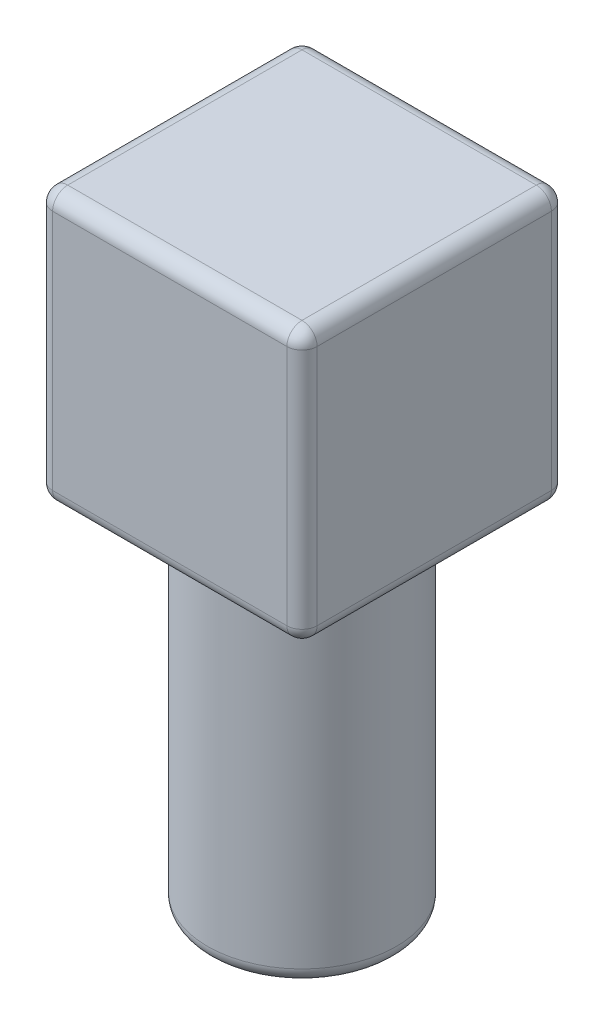
ISO-10303-21;
HEADER;
FILE_DESCRIPTION(('STEP AP214'),'2;1');
FILE_NAME('part.step','',(''),(''),'','','');
FILE_SCHEMA(('AUTOMOTIVE_DESIGN { 1 0 10303 214 1 1 1 1 }'));
ENDSEC;
DATA;
#1=APPLICATION_CONTEXT('core data for automotive mechanical design processes');
#2=APPLICATION_PROTOCOL_DEFINITION('international standard','automotive_design',2000,#1);
#3=PRODUCT_CONTEXT('',#1,'mechanical');
#4=PRODUCT('Part','Part','',(#3));
#5=PRODUCT_RELATED_PRODUCT_CATEGORY('part','',(#4));
#6=PRODUCT_DEFINITION_FORMATION('','',#4);
#7=PRODUCT_DEFINITION_CONTEXT('part definition',#1,'design');
#8=PRODUCT_DEFINITION('design','',#6,#7);
#9=PRODUCT_DEFINITION_SHAPE('','',#8);
#10=(LENGTH_UNIT() NAMED_UNIT(*) SI_UNIT(.MILLI.,.METRE.));
#11=(NAMED_UNIT(*) PLANE_ANGLE_UNIT() SI_UNIT($,.RADIAN.));
#12=(NAMED_UNIT(*) SI_UNIT($,.STERADIAN.) SOLID_ANGLE_UNIT());
#13=UNCERTAINTY_MEASURE_WITH_UNIT(LENGTH_MEASURE(1.E-05),#10,'distance_accuracy_value','');
#14=(GEOMETRIC_REPRESENTATION_CONTEXT(3) GLOBAL_UNCERTAINTY_ASSIGNED_CONTEXT((#13)) GLOBAL_UNIT_ASSIGNED_CONTEXT((#10,
#11,#12)) REPRESENTATION_CONTEXT('',''));
#15=CARTESIAN_POINT('',(0.,0.,0.));
#16=DIRECTION('',(0.,0.,1.));
#17=DIRECTION('',(1.,0.,0.));
#18=AXIS2_PLACEMENT_3D('',#15,#16,#17);
#19=CARTESIAN_POINT('',(0.,47.,0.));
#20=DIRECTION('',(0.,-1.,0.));
#21=DIRECTION('',(0.,0.,-1.));
#22=AXIS2_PLACEMENT_3D('',#19,#20,#21);
#23=CYLINDRICAL_SURFACE('',#22,12.5);
#24=CARTESIAN_POINT('',(0.,2.,0.));
#25=DIRECTION('',(0.,1.,0.));
#26=DIRECTION('',(0.,0.,1.));
#27=AXIS2_PLACEMENT_3D('',#24,#25,#26);
#28=CIRCLE('',#27,12.5);
#29=CARTESIAN_POINT('',(0.,2.,12.5));
#30=VERTEX_POINT('',#29);
#31=EDGE_CURVE('E170',#30,#30,#28,.T.);
#32=ORIENTED_EDGE('',*,*,#31,.T.);
#33=EDGE_LOOP('',(#32));
#34=FACE_BOUND('',#33,.T.);
#35=CARTESIAN_POINT('',(0.,47.,0.));
#36=DIRECTION('',(0.,1.,0.));
#37=DIRECTION('',(0.,0.,1.));
#38=AXIS2_PLACEMENT_3D('',#35,#36,#37);
#39=CIRCLE('',#38,12.5);
#40=CARTESIAN_POINT('',(0.,47.,12.5));
#41=VERTEX_POINT('',#40);
#42=EDGE_CURVE('E267',#41,#41,#39,.T.);
#43=ORIENTED_EDGE('',*,*,#42,.F.);
#44=EDGE_LOOP('',(#43));
#45=FACE_BOUND('',#44,.T.);
#46=ADVANCED_FACE('F40',(#34,#45),#23,.T.);
#47=CARTESIAN_POINT('',(0.,0.,0.));
#48=DIRECTION('',(0.,1.,0.));
#49=DIRECTION('',(0.,0.,1.));
#50=AXIS2_PLACEMENT_3D('',#47,#48,#49);
#51=PLANE('',#50);
#52=CARTESIAN_POINT('',(0.,0.,0.));
#53=DIRECTION('',(0.,1.,0.));
#54=DIRECTION('',(0.,0.,1.));
#55=AXIS2_PLACEMENT_3D('',#52,#53,#54);
#56=CIRCLE('',#55,10.5);
#57=CARTESIAN_POINT('',(0.,0.,10.5));
#58=VERTEX_POINT('',#57);
#59=EDGE_CURVE('E167',#58,#58,#56,.F.);
#60=ORIENTED_EDGE('',*,*,#59,.T.);
#61=EDGE_LOOP('',(#60));
#62=FACE_BOUND('',#61,.T.);
#63=ADVANCED_FACE('F296',(#62),#51,.F.);
#64=CARTESIAN_POINT('',(-17.5,83.,17.5));
#65=DIRECTION('',(-1.,0.,0.));
#66=DIRECTION('',(0.,0.,1.));
#67=AXIS2_PLACEMENT_3D('',#64,#65,#66);
#68=PLANE('',#67);
#69=DIRECTION('',(0.,0.,-1.));
#70=VECTOR('',#69,1.);
#71=CARTESIAN_POINT('',(-17.5,81.,-17.5));
#72=LINE('',#71,#70);
#73=CARTESIAN_POINT('',(-17.5,81.,15.5));
#74=VERTEX_POINT('',#73);
#75=CARTESIAN_POINT('',(-17.5,81.,-15.5));
#76=VERTEX_POINT('',#75);
#77=EDGE_CURVE('E179',#74,#76,#72,.T.);
#78=ORIENTED_EDGE('',*,*,#77,.T.);
#79=DIRECTION('',(0.,-1.,0.));
#80=VECTOR('',#79,1.);
#81=CARTESIAN_POINT('',(-17.5,83.,-15.5));
#82=LINE('',#81,#80);
#83=CARTESIAN_POINT('',(-17.5,49.,-15.5));
#84=VERTEX_POINT('',#83);
#85=EDGE_CURVE('E184',#76,#84,#82,.T.);
#86=ORIENTED_EDGE('',*,*,#85,.T.);
#87=DIRECTION('',(0.,0.,-1.));
#88=VECTOR('',#87,1.);
#89=CARTESIAN_POINT('',(-17.5,49.,17.5));
#90=LINE('',#89,#88);
#91=CARTESIAN_POINT('',(-17.5,49.,15.5));
#92=VERTEX_POINT('',#91);
#93=EDGE_CURVE('E181',#84,#92,#90,.F.);
#94=ORIENTED_EDGE('',*,*,#93,.T.);
#95=DIRECTION('',(0.,-1.,0.));
#96=VECTOR('',#95,1.);
#97=CARTESIAN_POINT('',(-17.5,83.,15.5));
#98=LINE('',#97,#96);
#99=EDGE_CURVE('E177',#92,#74,#98,.F.);
#100=ORIENTED_EDGE('',*,*,#99,.T.);
#101=EDGE_LOOP('',(#78,#86,#94,#100));
#102=FACE_BOUND('',#101,.T.);
#103=ADVANCED_FACE('F300',(#102),#68,.T.);
#104=CARTESIAN_POINT('',(-17.5,83.,17.5));
#105=DIRECTION('',(0.,0.,-1.));
#106=DIRECTION('',(-1.,0.,0.));
#107=AXIS2_PLACEMENT_3D('',#104,#105,#106);
#108=PLANE('',#107);
#109=DIRECTION('',(1.,0.,0.));
#110=VECTOR('',#109,1.);
#111=CARTESIAN_POINT('',(17.5,49.,17.5));
#112=LINE('',#111,#110);
#113=CARTESIAN_POINT('',(-15.5,49.,17.5));
#114=VERTEX_POINT('',#113);
#115=CARTESIAN_POINT('',(15.5,49.,17.5));
#116=VERTEX_POINT('',#115);
#117=EDGE_CURVE('E206',#114,#116,#112,.T.);
#118=ORIENTED_EDGE('',*,*,#117,.T.);
#119=DIRECTION('',(0.,-1.,0.));
#120=VECTOR('',#119,1.);
#121=CARTESIAN_POINT('',(15.5,83.,17.5));
#122=LINE('',#121,#120);
#123=CARTESIAN_POINT('',(15.5,81.,17.5));
#124=VERTEX_POINT('',#123);
#125=EDGE_CURVE('E209',#116,#124,#122,.F.);
#126=ORIENTED_EDGE('',*,*,#125,.T.);
#127=DIRECTION('',(1.,0.,0.));
#128=VECTOR('',#127,1.);
#129=CARTESIAN_POINT('',(-17.5,81.,17.5));
#130=LINE('',#129,#128);
#131=CARTESIAN_POINT('',(-15.5,81.,17.5));
#132=VERTEX_POINT('',#131);
#133=EDGE_CURVE('E204',#124,#132,#130,.F.);
#134=ORIENTED_EDGE('',*,*,#133,.T.);
#135=DIRECTION('',(0.,-1.,0.));
#136=VECTOR('',#135,1.);
#137=CARTESIAN_POINT('',(-15.5,47.,17.5));
#138=LINE('',#137,#136);
#139=EDGE_CURVE('E202',#132,#114,#138,.T.);
#140=ORIENTED_EDGE('',*,*,#139,.T.);
#141=EDGE_LOOP('',(#118,#126,#134,#140));
#142=FACE_BOUND('',#141,.T.);
#143=ADVANCED_FACE('F306',(#142),#108,.F.);
#144=CARTESIAN_POINT('',(17.5,83.,17.5));
#145=DIRECTION('',(-1.,0.,0.));
#146=DIRECTION('',(0.,0.,1.));
#147=AXIS2_PLACEMENT_3D('',#144,#145,#146);
#148=PLANE('',#147);
#149=DIRECTION('',(0.,0.,-1.));
#150=VECTOR('',#149,1.);
#151=CARTESIAN_POINT('',(17.5,49.,-17.5));
#152=LINE('',#151,#150);
#153=CARTESIAN_POINT('',(17.5,49.,15.5));
#154=VERTEX_POINT('',#153);
#155=CARTESIAN_POINT('',(17.5,49.,-15.5));
#156=VERTEX_POINT('',#155);
#157=EDGE_CURVE('E148',#154,#156,#152,.T.);
#158=ORIENTED_EDGE('',*,*,#157,.T.);
#159=DIRECTION('',(0.,-1.,0.));
#160=VECTOR('',#159,1.);
#161=CARTESIAN_POINT('',(17.5,83.,-15.5));
#162=LINE('',#161,#160);
#163=CARTESIAN_POINT('',(17.5,81.,-15.5));
#164=VERTEX_POINT('',#163);
#165=EDGE_CURVE('E200',#156,#164,#162,.F.);
#166=ORIENTED_EDGE('',*,*,#165,.T.);
#167=DIRECTION('',(0.,0.,-1.));
#168=VECTOR('',#167,1.);
#169=CARTESIAN_POINT('',(17.5,81.,17.5));
#170=LINE('',#169,#168);
#171=CARTESIAN_POINT('',(17.5,81.,15.5));
#172=VERTEX_POINT('',#171);
#173=EDGE_CURVE('E197',#164,#172,#170,.F.);
#174=ORIENTED_EDGE('',*,*,#173,.T.);
#175=DIRECTION('',(0.,-1.,0.));
#176=VECTOR('',#175,1.);
#177=CARTESIAN_POINT('',(17.5,83.,15.5));
#178=LINE('',#177,#176);
#179=EDGE_CURVE('E195',#172,#154,#178,.T.);
#180=ORIENTED_EDGE('',*,*,#179,.T.);
#181=EDGE_LOOP('',(#158,#166,#174,#180));
#182=FACE_BOUND('',#181,.T.);
#183=ADVANCED_FACE('F311',(#182),#148,.F.);
#184=CARTESIAN_POINT('',(-17.5,83.,-17.5));
#185=DIRECTION('',(0.,0.,-1.));
#186=DIRECTION('',(-1.,0.,0.));
#187=AXIS2_PLACEMENT_3D('',#184,#185,#186);
#188=PLANE('',#187);
#189=DIRECTION('',(1.,0.,0.));
#190=VECTOR('',#189,1.);
#191=CARTESIAN_POINT('',(-17.5,49.,-17.5));
#192=LINE('',#191,#190);
#193=CARTESIAN_POINT('',(15.5,49.,-17.5));
#194=VERTEX_POINT('',#193);
#195=CARTESIAN_POINT('',(-15.5,49.,-17.5));
#196=VERTEX_POINT('',#195);
#197=EDGE_CURVE('E190',#194,#196,#192,.F.);
#198=ORIENTED_EDGE('',*,*,#197,.T.);
#199=DIRECTION('',(0.,-1.,0.));
#200=VECTOR('',#199,1.);
#201=CARTESIAN_POINT('',(-15.5,83.,-17.5));
#202=LINE('',#201,#200);
#203=CARTESIAN_POINT('',(-15.5,81.,-17.5));
#204=VERTEX_POINT('',#203);
#205=EDGE_CURVE('E193',#196,#204,#202,.F.);
#206=ORIENTED_EDGE('',*,*,#205,.T.);
#207=DIRECTION('',(1.,0.,0.));
#208=VECTOR('',#207,1.);
#209=CARTESIAN_POINT('',(17.5,81.,-17.5));
#210=LINE('',#209,#208);
#211=CARTESIAN_POINT('',(15.5,81.,-17.5));
#212=VERTEX_POINT('',#211);
#213=EDGE_CURVE('E188',#204,#212,#210,.T.);
#214=ORIENTED_EDGE('',*,*,#213,.T.);
#215=DIRECTION('',(0.,-1.,0.));
#216=VECTOR('',#215,1.);
#217=CARTESIAN_POINT('',(15.5,47.,-17.5));
#218=LINE('',#217,#216);
#219=EDGE_CURVE('E186',#212,#194,#218,.T.);
#220=ORIENTED_EDGE('',*,*,#219,.T.);
#221=EDGE_LOOP('',(#198,#206,#214,#220));
#222=FACE_BOUND('',#221,.T.);
#223=ADVANCED_FACE('F308',(#222),#188,.T.);
#224=CARTESIAN_POINT('',(0.,83.,0.));
#225=DIRECTION('',(0.,-1.,0.));
#226=DIRECTION('',(0.,0.,-1.));
#227=AXIS2_PLACEMENT_3D('',#224,#225,#226);
#228=PLANE('',#227);
#229=DIRECTION('',(1.,0.,0.));
#230=VECTOR('',#229,1.);
#231=CARTESIAN_POINT('',(-17.5,83.,-15.5));
#232=LINE('',#231,#230);
#233=CARTESIAN_POINT('',(15.5,83.,-15.5));
#234=VERTEX_POINT('',#233);
#235=CARTESIAN_POINT('',(-15.5,83.,-15.5));
#236=VERTEX_POINT('',#235);
#237=EDGE_CURVE('E49',#234,#236,#232,.F.);
#238=ORIENTED_EDGE('',*,*,#237,.T.);
#239=DIRECTION('',(0.,0.,-1.));
#240=VECTOR('',#239,1.);
#241=CARTESIAN_POINT('',(-15.5,83.,17.5));
#242=LINE('',#241,#240);
#243=CARTESIAN_POINT('',(-15.5,83.,15.5));
#244=VERTEX_POINT('',#243);
#245=EDGE_CURVE('E11',#236,#244,#242,.F.);
#246=ORIENTED_EDGE('',*,*,#245,.T.);
#247=DIRECTION('',(1.,0.,0.));
#248=VECTOR('',#247,1.);
#249=CARTESIAN_POINT('',(0.,83.,15.5));
#250=LINE('',#249,#248);
#251=CARTESIAN_POINT('',(15.5,83.,15.5));
#252=VERTEX_POINT('',#251);
#253=EDGE_CURVE('E211',#244,#252,#250,.T.);
#254=ORIENTED_EDGE('',*,*,#253,.T.);
#255=DIRECTION('',(0.,0.,-1.));
#256=VECTOR('',#255,1.);
#257=CARTESIAN_POINT('',(15.5,83.,0.));
#258=LINE('',#257,#256);
#259=EDGE_CURVE('E60',#252,#234,#258,.T.);
#260=ORIENTED_EDGE('',*,*,#259,.T.);
#261=EDGE_LOOP('',(#238,#246,#254,#260));
#262=FACE_BOUND('',#261,.T.);
#263=ADVANCED_FACE('F290',(#262),#228,.F.);
#264=CARTESIAN_POINT('',(0.,47.,0.));
#265=DIRECTION('',(0.,-1.,0.));
#266=DIRECTION('',(0.,0.,-1.));
#267=AXIS2_PLACEMENT_3D('',#264,#265,#266);
#268=PLANE('',#267);
#269=DIRECTION('',(1.,0.,0.));
#270=VECTOR('',#269,1.);
#271=CARTESIAN_POINT('',(-17.5,47.,15.5));
#272=LINE('',#271,#270);
#273=CARTESIAN_POINT('',(15.5,47.,15.5));
#274=VERTEX_POINT('',#273);
#275=CARTESIAN_POINT('',(-15.5,47.,15.5));
#276=VERTEX_POINT('',#275);
#277=EDGE_CURVE('E134',#274,#276,#272,.F.);
#278=ORIENTED_EDGE('',*,*,#277,.T.);
#279=DIRECTION('',(0.,0.,-1.));
#280=VECTOR('',#279,1.);
#281=CARTESIAN_POINT('',(-15.5,47.,0.));
#282=LINE('',#281,#280);
#283=CARTESIAN_POINT('',(-15.5,47.,-15.5));
#284=VERTEX_POINT('',#283);
#285=EDGE_CURVE('E175',#276,#284,#282,.T.);
#286=ORIENTED_EDGE('',*,*,#285,.T.);
#287=DIRECTION('',(1.,0.,0.));
#288=VECTOR('',#287,1.);
#289=CARTESIAN_POINT('',(0.,47.,-15.5));
#290=LINE('',#289,#288);
#291=CARTESIAN_POINT('',(15.5,47.,-15.5));
#292=VERTEX_POINT('',#291);
#293=EDGE_CURVE('E137',#284,#292,#290,.T.);
#294=ORIENTED_EDGE('',*,*,#293,.T.);
#295=DIRECTION('',(0.,0.,-1.));
#296=VECTOR('',#295,1.);
#297=CARTESIAN_POINT('',(15.5,47.,17.5));
#298=LINE('',#297,#296);
#299=EDGE_CURVE('E128',#292,#274,#298,.F.);
#300=ORIENTED_EDGE('',*,*,#299,.T.);
#301=EDGE_LOOP('',(#278,#286,#294,#300));
#302=FACE_BOUND('',#301,.T.);
#303=ORIENTED_EDGE('',*,*,#42,.T.);
#304=EDGE_LOOP('',(#303));
#305=FACE_BOUND('',#304,.T.);
#306=ADVANCED_FACE('F130',(#302,#305),#268,.T.);
#307=CARTESIAN_POINT('',(0.,2.,0.));
#308=DIRECTION('',(0.,1.,0.));
#309=DIRECTION('',(0.,0.,1.));
#310=AXIS2_PLACEMENT_3D('',#307,#308,#309);
#311=TOROIDAL_SURFACE('',#310,10.5,2.);
#312=ORIENTED_EDGE('',*,*,#59,.F.);
#313=EDGE_LOOP('',(#312));
#314=FACE_BOUND('',#313,.T.);
#315=ORIENTED_EDGE('',*,*,#31,.F.);
#316=EDGE_LOOP('',(#315));
#317=FACE_BOUND('',#316,.T.);
#318=ADVANCED_FACE('F280',(#314,#317),#311,.T.);
#319=CARTESIAN_POINT('',(15.5,81.,0.));
#320=DIRECTION('',(0.,0.,-1.));
#321=DIRECTION('',(-1.,0.,0.));
#322=AXIS2_PLACEMENT_3D('',#319,#320,#321);
#323=CYLINDRICAL_SURFACE('',#322,2.);
#324=CARTESIAN_POINT('',(15.5,81.,15.5));
#325=DIRECTION('',(0.,0.,1.));
#326=DIRECTION('',(1.,0.,0.));
#327=AXIS2_PLACEMENT_3D('',#324,#325,#326);
#328=CIRCLE('',#327,2.);
#329=EDGE_CURVE('E44',#172,#252,#328,.T.);
#330=ORIENTED_EDGE('',*,*,#329,.F.);
#331=ORIENTED_EDGE('',*,*,#173,.F.);
#332=CARTESIAN_POINT('',(15.5,81.,-15.5));
#333=DIRECTION('',(0.,0.,-1.));
#334=DIRECTION('',(-1.,0.,0.));
#335=AXIS2_PLACEMENT_3D('',#332,#333,#334);
#336=CIRCLE('',#335,2.);
#337=EDGE_CURVE('E261',#234,#164,#336,.T.);
#338=ORIENTED_EDGE('',*,*,#337,.F.);
#339=ORIENTED_EDGE('',*,*,#259,.F.);
#340=EDGE_LOOP('',(#330,#331,#338,#339));
#341=FACE_BOUND('',#340,.T.);
#342=ADVANCED_FACE('F42',(#341),#323,.T.);
#343=CARTESIAN_POINT('',(15.5,81.,15.5));
#344=DIRECTION('',(0.,1.,0.));
#345=DIRECTION('',(0.,0.,1.));
#346=AXIS2_PLACEMENT_3D('',#343,#344,#345);
#347=SPHERICAL_SURFACE('',#346,2.);
#348=CARTESIAN_POINT('',(15.5,81.,15.5));
#349=DIRECTION('',(0.,1.,0.));
#350=DIRECTION('',(0.,0.,1.));
#351=AXIS2_PLACEMENT_3D('',#348,#349,#350);
#352=CIRCLE('',#351,2.);
#353=EDGE_CURVE('E256',#172,#124,#352,.F.);
#354=ORIENTED_EDGE('',*,*,#353,.F.);
#355=ORIENTED_EDGE('',*,*,#329,.T.);
#356=CARTESIAN_POINT('',(15.5,81.,15.5));
#357=DIRECTION('',(1.,0.,0.));
#358=DIRECTION('',(0.,0.,-1.));
#359=AXIS2_PLACEMENT_3D('',#356,#357,#358);
#360=CIRCLE('',#359,2.);
#361=EDGE_CURVE('E259',#124,#252,#360,.F.);
#362=ORIENTED_EDGE('',*,*,#361,.F.);
#363=EDGE_LOOP('',(#354,#355,#362));
#364=FACE_BOUND('',#363,.T.);
#365=ADVANCED_FACE('F288',(#364),#347,.T.);
#366=CARTESIAN_POINT('',(15.5,81.,-15.5));
#367=DIRECTION('',(1.,0.,0.));
#368=DIRECTION('',(0.,0.,-1.));
#369=AXIS2_PLACEMENT_3D('',#366,#367,#368);
#370=SPHERICAL_SURFACE('',#369,2.);
#371=CARTESIAN_POINT('',(15.5,81.,-15.5));
#372=DIRECTION('',(1.,0.,0.));
#373=DIRECTION('',(0.,1.,0.));
#374=AXIS2_PLACEMENT_3D('',#371,#372,#373);
#375=CIRCLE('',#374,2.);
#376=EDGE_CURVE('E250',#234,#212,#375,.F.);
#377=ORIENTED_EDGE('',*,*,#376,.F.);
#378=ORIENTED_EDGE('',*,*,#337,.T.);
#379=CARTESIAN_POINT('',(15.5,81.,-15.5));
#380=DIRECTION('',(0.,1.,0.));
#381=DIRECTION('',(0.,0.,1.));
#382=AXIS2_PLACEMENT_3D('',#379,#380,#381);
#383=CIRCLE('',#382,2.);
#384=EDGE_CURVE('E253',#212,#164,#383,.F.);
#385=ORIENTED_EDGE('',*,*,#384,.F.);
#386=EDGE_LOOP('',(#377,#378,#385));
#387=FACE_BOUND('',#386,.T.);
#388=ADVANCED_FACE('F349',(#387),#370,.T.);
#389=CARTESIAN_POINT('',(0.,81.,15.5));
#390=DIRECTION('',(1.,0.,0.));
#391=DIRECTION('',(0.,0.,-1.));
#392=AXIS2_PLACEMENT_3D('',#389,#390,#391);
#393=CYLINDRICAL_SURFACE('',#392,2.);
#394=ORIENTED_EDGE('',*,*,#361,.T.);
#395=ORIENTED_EDGE('',*,*,#253,.F.);
#396=CARTESIAN_POINT('',(-15.5,81.,15.5));
#397=DIRECTION('',(-1.,0.,0.));
#398=DIRECTION('',(0.,0.,1.));
#399=AXIS2_PLACEMENT_3D('',#396,#397,#398);
#400=CIRCLE('',#399,2.);
#401=EDGE_CURVE('E245',#132,#244,#400,.T.);
#402=ORIENTED_EDGE('',*,*,#401,.F.);
#403=ORIENTED_EDGE('',*,*,#133,.F.);
#404=EDGE_LOOP('',(#394,#395,#402,#403));
#405=FACE_BOUND('',#404,.T.);
#406=ADVANCED_FACE('F357',(#405),#393,.T.);
#407=CARTESIAN_POINT('',(15.5,83.,15.5));
#408=DIRECTION('',(0.,-1.,0.));
#409=DIRECTION('',(0.,0.,-1.));
#410=AXIS2_PLACEMENT_3D('',#407,#408,#409);
#411=CYLINDRICAL_SURFACE('',#410,2.);
#412=ORIENTED_EDGE('',*,*,#353,.T.);
#413=ORIENTED_EDGE('',*,*,#125,.F.);
#414=CARTESIAN_POINT('',(15.5,49.,15.5));
#415=DIRECTION('',(0.,-1.,0.));
#416=DIRECTION('',(0.,0.,-1.));
#417=AXIS2_PLACEMENT_3D('',#414,#415,#416);
#418=CIRCLE('',#417,2.);
#419=EDGE_CURVE('E152',#154,#116,#418,.T.);
#420=ORIENTED_EDGE('',*,*,#419,.F.);
#421=ORIENTED_EDGE('',*,*,#179,.F.);
#422=EDGE_LOOP('',(#412,#413,#420,#421));
#423=FACE_BOUND('',#422,.T.);
#424=ADVANCED_FACE('F366',(#423),#411,.T.);
#425=CARTESIAN_POINT('',(15.5,49.,17.5));
#426=DIRECTION('',(0.,0.,1.));
#427=DIRECTION('',(1.,0.,0.));
#428=AXIS2_PLACEMENT_3D('',#425,#426,#427);
#429=CYLINDRICAL_SURFACE('',#428,2.);
#430=CARTESIAN_POINT('',(15.5,49.,-15.5));
#431=DIRECTION('',(0.,0.,-1.));
#432=DIRECTION('',(-1.,0.,0.));
#433=AXIS2_PLACEMENT_3D('',#430,#431,#432);
#434=CIRCLE('',#433,2.);
#435=EDGE_CURVE('E153',#156,#292,#434,.T.);
#436=ORIENTED_EDGE('',*,*,#435,.F.);
#437=ORIENTED_EDGE('',*,*,#157,.F.);
#438=CARTESIAN_POINT('',(15.5,49.,15.5));
#439=DIRECTION('',(0.,0.,1.));
#440=DIRECTION('',(1.,0.,0.));
#441=AXIS2_PLACEMENT_3D('',#438,#439,#440);
#442=CIRCLE('',#441,2.);
#443=EDGE_CURVE('E144',#274,#154,#442,.T.);
#444=ORIENTED_EDGE('',*,*,#443,.F.);
#445=ORIENTED_EDGE('',*,*,#299,.F.);
#446=EDGE_LOOP('',(#436,#437,#444,#445));
#447=FACE_BOUND('',#446,.T.);
#448=ADVANCED_FACE('F146',(#447),#429,.T.);
#449=CARTESIAN_POINT('',(15.5,83.,-15.5));
#450=DIRECTION('',(0.,1.,0.));
#451=DIRECTION('',(0.,0.,1.));
#452=AXIS2_PLACEMENT_3D('',#449,#450,#451);
#453=CYLINDRICAL_SURFACE('',#452,2.);
#454=ORIENTED_EDGE('',*,*,#384,.T.);
#455=ORIENTED_EDGE('',*,*,#165,.F.);
#456=CARTESIAN_POINT('',(15.5,49.,-15.5));
#457=DIRECTION('',(0.,-1.,0.));
#458=DIRECTION('',(0.,0.,-1.));
#459=AXIS2_PLACEMENT_3D('',#456,#457,#458);
#460=CIRCLE('',#459,2.);
#461=EDGE_CURVE('E241',#194,#156,#460,.T.);
#462=ORIENTED_EDGE('',*,*,#461,.F.);
#463=ORIENTED_EDGE('',*,*,#219,.F.);
#464=EDGE_LOOP('',(#454,#455,#462,#463));
#465=FACE_BOUND('',#464,.T.);
#466=ADVANCED_FACE('F385',(#465),#453,.T.);
#467=CARTESIAN_POINT('',(-17.5,81.,-15.5));
#468=DIRECTION('',(-1.,0.,0.));
#469=DIRECTION('',(0.,0.,1.));
#470=AXIS2_PLACEMENT_3D('',#467,#468,#469);
#471=CYLINDRICAL_SURFACE('',#470,2.);
#472=ORIENTED_EDGE('',*,*,#376,.T.);
#473=ORIENTED_EDGE('',*,*,#213,.F.);
#474=CARTESIAN_POINT('',(-15.5,81.,-15.5));
#475=DIRECTION('',(-1.,0.,0.));
#476=DIRECTION('',(0.,0.,1.));
#477=AXIS2_PLACEMENT_3D('',#474,#475,#476);
#478=CIRCLE('',#477,2.);
#479=EDGE_CURVE('E238',#236,#204,#478,.T.);
#480=ORIENTED_EDGE('',*,*,#479,.F.);
#481=ORIENTED_EDGE('',*,*,#237,.F.);
#482=EDGE_LOOP('',(#472,#473,#480,#481));
#483=FACE_BOUND('',#482,.T.);
#484=ADVANCED_FACE('F394',(#483),#471,.T.);
#485=CARTESIAN_POINT('',(-15.5,81.,17.5));
#486=DIRECTION('',(0.,0.,1.));
#487=DIRECTION('',(1.,0.,0.));
#488=AXIS2_PLACEMENT_3D('',#485,#486,#487);
#489=CYLINDRICAL_SURFACE('',#488,2.);
#490=CARTESIAN_POINT('',(-15.5,81.,15.5));
#491=DIRECTION('',(0.,0.,1.));
#492=DIRECTION('',(1.,0.,0.));
#493=AXIS2_PLACEMENT_3D('',#490,#491,#492);
#494=CIRCLE('',#493,2.);
#495=EDGE_CURVE('E247',#244,#74,#494,.T.);
#496=ORIENTED_EDGE('',*,*,#495,.F.);
#497=ORIENTED_EDGE('',*,*,#245,.F.);
#498=CARTESIAN_POINT('',(-15.5,81.,-15.5));
#499=DIRECTION('',(0.,0.,-1.));
#500=DIRECTION('',(0.,1.,0.));
#501=AXIS2_PLACEMENT_3D('',#498,#499,#500);
#502=CIRCLE('',#501,2.);
#503=EDGE_CURVE('E235',#76,#236,#502,.T.);
#504=ORIENTED_EDGE('',*,*,#503,.F.);
#505=ORIENTED_EDGE('',*,*,#77,.F.);
#506=EDGE_LOOP('',(#496,#497,#504,#505));
#507=FACE_BOUND('',#506,.T.);
#508=ADVANCED_FACE('F404',(#507),#489,.T.);
#509=CARTESIAN_POINT('',(-15.5,81.,15.5));
#510=DIRECTION('',(0.,1.,0.));
#511=DIRECTION('',(0.,0.,1.));
#512=AXIS2_PLACEMENT_3D('',#509,#510,#511);
#513=SPHERICAL_SURFACE('',#512,2.);
#514=ORIENTED_EDGE('',*,*,#401,.T.);
#515=ORIENTED_EDGE('',*,*,#495,.T.);
#516=CARTESIAN_POINT('',(-15.5,81.,15.5));
#517=DIRECTION('',(0.,1.,0.));
#518=DIRECTION('',(0.,0.,1.));
#519=AXIS2_PLACEMENT_3D('',#516,#517,#518);
#520=CIRCLE('',#519,2.);
#521=EDGE_CURVE('E160',#132,#74,#520,.F.);
#522=ORIENTED_EDGE('',*,*,#521,.F.);
#523=EDGE_LOOP('',(#514,#515,#522));
#524=FACE_BOUND('',#523,.T.);
#525=ADVANCED_FACE('F414',(#524),#513,.T.);
#526=CARTESIAN_POINT('',(15.5,49.,15.5));
#527=DIRECTION('',(1.,0.,0.));
#528=DIRECTION('',(0.,0.,-1.));
#529=AXIS2_PLACEMENT_3D('',#526,#527,#528);
#530=SPHERICAL_SURFACE('',#529,2.);
#531=ORIENTED_EDGE('',*,*,#443,.T.);
#532=ORIENTED_EDGE('',*,*,#419,.T.);
#533=CARTESIAN_POINT('',(15.5,49.,15.5));
#534=DIRECTION('',(1.,0.,0.));
#535=DIRECTION('',(0.,0.,-1.));
#536=AXIS2_PLACEMENT_3D('',#533,#534,#535);
#537=CIRCLE('',#536,2.);
#538=EDGE_CURVE('E155',#274,#116,#537,.F.);
#539=ORIENTED_EDGE('',*,*,#538,.F.);
#540=EDGE_LOOP('',(#531,#532,#539));
#541=FACE_BOUND('',#540,.T.);
#542=ADVANCED_FACE('F156',(#541),#530,.T.);
#543=CARTESIAN_POINT('',(15.5,49.,-15.5));
#544=DIRECTION('',(1.,0.,0.));
#545=DIRECTION('',(0.,0.,-1.));
#546=AXIS2_PLACEMENT_3D('',#543,#544,#545);
#547=SPHERICAL_SURFACE('',#546,2.);
#548=ORIENTED_EDGE('',*,*,#461,.T.);
#549=ORIENTED_EDGE('',*,*,#435,.T.);
#550=CARTESIAN_POINT('',(15.5,49.,-15.5));
#551=DIRECTION('',(1.,0.,0.));
#552=DIRECTION('',(0.,0.,-1.));
#553=AXIS2_PLACEMENT_3D('',#550,#551,#552);
#554=CIRCLE('',#553,2.);
#555=EDGE_CURVE('E161',#194,#292,#554,.F.);
#556=ORIENTED_EDGE('',*,*,#555,.F.);
#557=EDGE_LOOP('',(#548,#549,#556));
#558=FACE_BOUND('',#557,.T.);
#559=ADVANCED_FACE('F433',(#558),#547,.T.);
#560=CARTESIAN_POINT('',(-15.5,81.,-15.5));
#561=DIRECTION('',(0.,1.,0.));
#562=DIRECTION('',(0.,0.,1.));
#563=AXIS2_PLACEMENT_3D('',#560,#561,#562);
#564=SPHERICAL_SURFACE('',#563,2.);
#565=ORIENTED_EDGE('',*,*,#503,.T.);
#566=ORIENTED_EDGE('',*,*,#479,.T.);
#567=CARTESIAN_POINT('',(-15.5,81.,-15.5));
#568=DIRECTION('',(0.,1.,0.));
#569=DIRECTION('',(0.,0.,1.));
#570=AXIS2_PLACEMENT_3D('',#567,#568,#569);
#571=CIRCLE('',#570,2.);
#572=EDGE_CURVE('E228',#76,#204,#571,.F.);
#573=ORIENTED_EDGE('',*,*,#572,.F.);
#574=EDGE_LOOP('',(#565,#566,#573));
#575=FACE_BOUND('',#574,.T.);
#576=ADVANCED_FACE('F442',(#575),#564,.T.);
#577=CARTESIAN_POINT('',(-15.5,83.,15.5));
#578=DIRECTION('',(0.,1.,0.));
#579=DIRECTION('',(0.,0.,1.));
#580=AXIS2_PLACEMENT_3D('',#577,#578,#579);
#581=CYLINDRICAL_SURFACE('',#580,2.);
#582=ORIENTED_EDGE('',*,*,#521,.T.);
#583=ORIENTED_EDGE('',*,*,#99,.F.);
#584=CARTESIAN_POINT('',(-15.5,49.,15.5));
#585=DIRECTION('',(0.,-1.,0.));
#586=DIRECTION('',(0.,0.,-1.));
#587=AXIS2_PLACEMENT_3D('',#584,#585,#586);
#588=CIRCLE('',#587,2.);
#589=EDGE_CURVE('E225',#114,#92,#588,.T.);
#590=ORIENTED_EDGE('',*,*,#589,.F.);
#591=ORIENTED_EDGE('',*,*,#139,.F.);
#592=EDGE_LOOP('',(#582,#583,#590,#591));
#593=FACE_BOUND('',#592,.T.);
#594=ADVANCED_FACE('F452',(#593),#581,.T.);
#595=CARTESIAN_POINT('',(-17.5,49.,15.5));
#596=DIRECTION('',(-1.,0.,0.));
#597=DIRECTION('',(0.,0.,1.));
#598=AXIS2_PLACEMENT_3D('',#595,#596,#597);
#599=CYLINDRICAL_SURFACE('',#598,2.);
#600=ORIENTED_EDGE('',*,*,#538,.T.);
#601=ORIENTED_EDGE('',*,*,#117,.F.);
#602=CARTESIAN_POINT('',(-15.5,49.,15.5));
#603=DIRECTION('',(-1.,0.,0.));
#604=DIRECTION('',(0.,0.,1.));
#605=AXIS2_PLACEMENT_3D('',#602,#603,#604);
#606=CIRCLE('',#605,2.);
#607=EDGE_CURVE('E165',#276,#114,#606,.T.);
#608=ORIENTED_EDGE('',*,*,#607,.F.);
#609=ORIENTED_EDGE('',*,*,#277,.F.);
#610=EDGE_LOOP('',(#600,#601,#608,#609));
#611=FACE_BOUND('',#610,.T.);
#612=ADVANCED_FACE('F163',(#611),#599,.T.);
#613=CARTESIAN_POINT('',(0.,49.,-15.5));
#614=DIRECTION('',(1.,0.,0.));
#615=DIRECTION('',(0.,0.,-1.));
#616=AXIS2_PLACEMENT_3D('',#613,#614,#615);
#617=CYLINDRICAL_SURFACE('',#616,2.);
#618=ORIENTED_EDGE('',*,*,#555,.T.);
#619=ORIENTED_EDGE('',*,*,#293,.F.);
#620=CARTESIAN_POINT('',(-15.5,49.,-15.5));
#621=DIRECTION('',(-1.,0.,0.));
#622=DIRECTION('',(0.,0.,1.));
#623=AXIS2_PLACEMENT_3D('',#620,#621,#622);
#624=CIRCLE('',#623,2.);
#625=EDGE_CURVE('E221',#196,#284,#624,.T.);
#626=ORIENTED_EDGE('',*,*,#625,.F.);
#627=ORIENTED_EDGE('',*,*,#197,.F.);
#628=EDGE_LOOP('',(#618,#619,#626,#627));
#629=FACE_BOUND('',#628,.T.);
#630=ADVANCED_FACE('F471',(#629),#617,.T.);
#631=CARTESIAN_POINT('',(-15.5,83.,-15.5));
#632=DIRECTION('',(0.,-1.,0.));
#633=DIRECTION('',(0.,0.,-1.));
#634=AXIS2_PLACEMENT_3D('',#631,#632,#633);
#635=CYLINDRICAL_SURFACE('',#634,2.);
#636=ORIENTED_EDGE('',*,*,#572,.T.);
#637=ORIENTED_EDGE('',*,*,#205,.F.);
#638=CARTESIAN_POINT('',(-15.5,49.,-15.5));
#639=DIRECTION('',(0.,-1.,0.));
#640=DIRECTION('',(0.,0.,-1.));
#641=AXIS2_PLACEMENT_3D('',#638,#639,#640);
#642=CIRCLE('',#641,2.);
#643=EDGE_CURVE('E219',#84,#196,#642,.T.);
#644=ORIENTED_EDGE('',*,*,#643,.F.);
#645=ORIENTED_EDGE('',*,*,#85,.F.);
#646=EDGE_LOOP('',(#636,#637,#644,#645));
#647=FACE_BOUND('',#646,.T.);
#648=ADVANCED_FACE('F480',(#647),#635,.T.);
#649=CARTESIAN_POINT('',(-15.5,49.,15.5));
#650=DIRECTION('',(0.,0.,1.));
#651=DIRECTION('',(1.,0.,0.));
#652=AXIS2_PLACEMENT_3D('',#649,#650,#651);
#653=SPHERICAL_SURFACE('',#652,2.);
#654=ORIENTED_EDGE('',*,*,#607,.T.);
#655=ORIENTED_EDGE('',*,*,#589,.T.);
#656=CARTESIAN_POINT('',(-15.5,49.,15.5));
#657=DIRECTION('',(0.,0.,1.));
#658=DIRECTION('',(1.,0.,0.));
#659=AXIS2_PLACEMENT_3D('',#656,#657,#658);
#660=CIRCLE('',#659,2.);
#661=EDGE_CURVE('E217',#276,#92,#660,.F.);
#662=ORIENTED_EDGE('',*,*,#661,.F.);
#663=EDGE_LOOP('',(#654,#655,#662));
#664=FACE_BOUND('',#663,.T.);
#665=ADVANCED_FACE('F490',(#664),#653,.T.);
#666=CARTESIAN_POINT('',(-15.5,49.,-15.5));
#667=DIRECTION('',(0.,0.,-1.));
#668=DIRECTION('',(-1.,0.,0.));
#669=AXIS2_PLACEMENT_3D('',#666,#667,#668);
#670=SPHERICAL_SURFACE('',#669,2.);
#671=ORIENTED_EDGE('',*,*,#643,.T.);
#672=ORIENTED_EDGE('',*,*,#625,.T.);
#673=CARTESIAN_POINT('',(-15.5,49.,-15.5));
#674=DIRECTION('',(0.,0.,-1.));
#675=DIRECTION('',(-1.,0.,0.));
#676=AXIS2_PLACEMENT_3D('',#673,#674,#675);
#677=CIRCLE('',#676,2.);
#678=EDGE_CURVE('E215',#84,#284,#677,.F.);
#679=ORIENTED_EDGE('',*,*,#678,.F.);
#680=EDGE_LOOP('',(#671,#672,#679));
#681=FACE_BOUND('',#680,.T.);
#682=ADVANCED_FACE('F500',(#681),#670,.T.);
#683=CARTESIAN_POINT('',(-15.5,49.,0.));
#684=DIRECTION('',(0.,0.,-1.));
#685=DIRECTION('',(-1.,0.,0.));
#686=AXIS2_PLACEMENT_3D('',#683,#684,#685);
#687=CYLINDRICAL_SURFACE('',#686,2.);
#688=ORIENTED_EDGE('',*,*,#661,.T.);
#689=ORIENTED_EDGE('',*,*,#93,.F.);
#690=ORIENTED_EDGE('',*,*,#678,.T.);
#691=ORIENTED_EDGE('',*,*,#285,.F.);
#692=EDGE_LOOP('',(#688,#689,#690,#691));
#693=FACE_BOUND('',#692,.T.);
#694=ADVANCED_FACE('F510',(#693),#687,.T.);
#695=CLOSED_SHELL('',(#46,#63,#103,#143,#183,#223,#263,#306,#318,#342,#365,#388,#406,#424,#448,
#466,#484,#508,#525,#542,#559,#576,#594,#612,#630,#648,#665,#682,#694));
#696=MANIFOLD_SOLID_BREP('B2',#695);
#697=ADVANCED_BREP_SHAPE_REPRESENTATION('',(#18,#696),#14);
#698=SHAPE_DEFINITION_REPRESENTATION(#9,#697);
ENDSEC;
END-ISO-10303-21;
